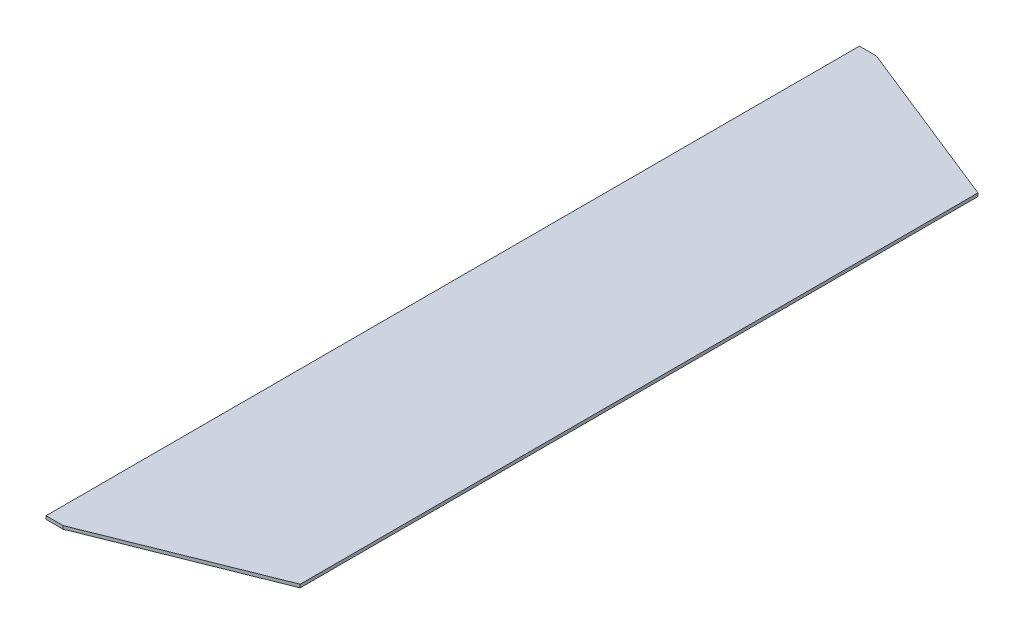
ISO-10303-21;
HEADER;
FILE_DESCRIPTION(('STEP AP214'),'2;1');
FILE_NAME('part.step','',(''),(''),'','','');
FILE_SCHEMA(('AUTOMOTIVE_DESIGN { 1 0 10303 214 1 1 1 1 }'));
ENDSEC;
DATA;
#1=APPLICATION_CONTEXT('core data for automotive mechanical design processes');
#2=APPLICATION_PROTOCOL_DEFINITION('international standard','automotive_design',2000,#1);
#3=PRODUCT_CONTEXT('',#1,'mechanical');
#4=PRODUCT('Part','Part','',(#3));
#5=PRODUCT_RELATED_PRODUCT_CATEGORY('part','',(#4));
#6=PRODUCT_DEFINITION_FORMATION('','',#4);
#7=PRODUCT_DEFINITION_CONTEXT('part definition',#1,'design');
#8=PRODUCT_DEFINITION('design','',#6,#7);
#9=PRODUCT_DEFINITION_SHAPE('','',#8);
#10=(LENGTH_UNIT() NAMED_UNIT(*) SI_UNIT(.MILLI.,.METRE.));
#11=(NAMED_UNIT(*) PLANE_ANGLE_UNIT() SI_UNIT($,.RADIAN.));
#12=(NAMED_UNIT(*) SI_UNIT($,.STERADIAN.) SOLID_ANGLE_UNIT());
#13=UNCERTAINTY_MEASURE_WITH_UNIT(LENGTH_MEASURE(1.E-05),#10,'distance_accuracy_value','');
#14=(GEOMETRIC_REPRESENTATION_CONTEXT(3) GLOBAL_UNCERTAINTY_ASSIGNED_CONTEXT((#13)) GLOBAL_UNIT_ASSIGNED_CONTEXT((#10,
#11,#12)) REPRESENTATION_CONTEXT('',''));
#15=CARTESIAN_POINT('',(0.,0.,0.));
#16=DIRECTION('',(0.,0.,1.));
#17=DIRECTION('',(1.,0.,0.));
#18=AXIS2_PLACEMENT_3D('',#15,#16,#17);
#19=CARTESIAN_POINT('',(34.925,-0.5969,152.4));
#20=DIRECTION('',(0.,1.,0.));
#21=DIRECTION('',(0.,0.,1.));
#22=AXIS2_PLACEMENT_3D('',#19,#20,#21);
#23=PLANE('',#22);
#24=DIRECTION('',(-0.928476690885259,0.,0.371390676354104));
#25=VECTOR('',#24,1.);
#26=CARTESIAN_POINT('',(-28.575,-0.5969,152.4));
#27=LINE('',#26,#25);
#28=CARTESIAN_POINT('',(34.925,-0.5969,127.));
#29=VERTEX_POINT('',#28);
#30=CARTESIAN_POINT('',(-28.575,-0.5969,152.4));
#31=VERTEX_POINT('',#30);
#32=EDGE_CURVE('E105',#29,#31,#27,.T.);
#33=ORIENTED_EDGE('',*,*,#32,.T.);
#34=DIRECTION('',(1.,0.,0.));
#35=VECTOR('',#34,1.);
#36=CARTESIAN_POINT('',(34.925,-0.5969,152.4));
#37=LINE('',#36,#35);
#38=CARTESIAN_POINT('',(-34.925,-0.5969,152.4));
#39=VERTEX_POINT('',#38);
#40=EDGE_CURVE('E115',#39,#31,#37,.T.);
#41=ORIENTED_EDGE('',*,*,#40,.F.);
#42=DIRECTION('',(0.,0.,-1.));
#43=VECTOR('',#42,1.);
#44=CARTESIAN_POINT('',(-34.925,-0.5969,152.4));
#45=LINE('',#44,#43);
#46=CARTESIAN_POINT('',(-34.925,-0.5969,-152.4));
#47=VERTEX_POINT('',#46);
#48=EDGE_CURVE('E12',#39,#47,#45,.T.);
#49=ORIENTED_EDGE('',*,*,#48,.T.);
#50=DIRECTION('',(1.,0.,0.));
#51=VECTOR('',#50,1.);
#52=CARTESIAN_POINT('',(34.925,-0.5969,-152.4));
#53=LINE('',#52,#51);
#54=CARTESIAN_POINT('',(-28.575,-0.5969,-152.4));
#55=VERTEX_POINT('',#54);
#56=EDGE_CURVE('E112',#47,#55,#53,.T.);
#57=ORIENTED_EDGE('',*,*,#56,.T.);
#58=DIRECTION('',(0.928476690885259,0.,0.371390676354103));
#59=VECTOR('',#58,1.);
#60=CARTESIAN_POINT('',(34.925,-0.5969,-127.));
#61=LINE('',#60,#59);
#62=CARTESIAN_POINT('',(34.925,-0.5969,-127.));
#63=VERTEX_POINT('',#62);
#64=EDGE_CURVE('E60',#55,#63,#61,.T.);
#65=ORIENTED_EDGE('',*,*,#64,.T.);
#66=DIRECTION('',(0.,0.,-1.));
#67=VECTOR('',#66,1.);
#68=CARTESIAN_POINT('',(34.925,-0.5969,152.4));
#69=LINE('',#68,#67);
#70=EDGE_CURVE('E45',#29,#63,#69,.T.);
#71=ORIENTED_EDGE('',*,*,#70,.F.);
#72=EDGE_LOOP('',(#33,#41,#49,#57,#65,#71));
#73=FACE_BOUND('',#72,.T.);
#74=ADVANCED_FACE('F37',(#73),#23,.F.);
#75=CARTESIAN_POINT('',(34.925,0.5969,152.4));
#76=DIRECTION('',(-1.,0.,0.));
#77=DIRECTION('',(0.,0.,1.));
#78=AXIS2_PLACEMENT_3D('',#75,#76,#77);
#79=PLANE('',#78);
#80=DIRECTION('',(0.,-1.,0.));
#81=VECTOR('',#80,1.);
#82=CARTESIAN_POINT('',(34.925,0.5969,127.));
#83=LINE('',#82,#81);
#84=CARTESIAN_POINT('',(34.925,0.5969,127.));
#85=VERTEX_POINT('',#84);
#86=EDGE_CURVE('E131',#85,#29,#83,.T.);
#87=ORIENTED_EDGE('',*,*,#86,.T.);
#88=ORIENTED_EDGE('',*,*,#70,.T.);
#89=DIRECTION('',(0.,-1.,0.));
#90=VECTOR('',#89,1.);
#91=CARTESIAN_POINT('',(34.925,0.5969,-127.));
#92=LINE('',#91,#90);
#93=CARTESIAN_POINT('',(34.925,0.5969,-127.));
#94=VERTEX_POINT('',#93);
#95=EDGE_CURVE('E95',#94,#63,#92,.T.);
#96=ORIENTED_EDGE('',*,*,#95,.F.);
#97=DIRECTION('',(0.,0.,-1.));
#98=VECTOR('',#97,1.);
#99=CARTESIAN_POINT('',(34.925,0.5969,152.4));
#100=LINE('',#99,#98);
#101=EDGE_CURVE('E104',#85,#94,#100,.T.);
#102=ORIENTED_EDGE('',*,*,#101,.F.);
#103=EDGE_LOOP('',(#87,#88,#96,#102));
#104=FACE_BOUND('',#103,.T.);
#105=ADVANCED_FACE('F130',(#104),#79,.F.);
#106=CARTESIAN_POINT('',(34.925,0.5969,152.4));
#107=DIRECTION('',(0.,-1.,0.));
#108=DIRECTION('',(0.,0.,-1.));
#109=AXIS2_PLACEMENT_3D('',#106,#107,#108);
#110=PLANE('',#109);
#111=DIRECTION('',(-0.928476690885259,0.,0.371390676354104));
#112=VECTOR('',#111,1.);
#113=CARTESIAN_POINT('',(-28.575,0.5969,152.4));
#114=LINE('',#113,#112);
#115=CARTESIAN_POINT('',(-28.575,0.5969,152.4));
#116=VERTEX_POINT('',#115);
#117=EDGE_CURVE('E52',#85,#116,#114,.T.);
#118=ORIENTED_EDGE('',*,*,#117,.F.);
#119=ORIENTED_EDGE('',*,*,#101,.T.);
#120=DIRECTION('',(0.928476690885259,0.,0.371390676354103));
#121=VECTOR('',#120,1.);
#122=CARTESIAN_POINT('',(34.925,0.5969,-127.));
#123=LINE('',#122,#121);
#124=CARTESIAN_POINT('',(-28.575,0.5969,-152.4));
#125=VERTEX_POINT('',#124);
#126=EDGE_CURVE('E89',#125,#94,#123,.T.);
#127=ORIENTED_EDGE('',*,*,#126,.F.);
#128=DIRECTION('',(-1.,0.,0.));
#129=VECTOR('',#128,1.);
#130=CARTESIAN_POINT('',(34.925,0.5969,-152.4));
#131=LINE('',#130,#129);
#132=CARTESIAN_POINT('',(-34.925,0.5969,-152.4));
#133=VERTEX_POINT('',#132);
#134=EDGE_CURVE('E101',#125,#133,#131,.T.);
#135=ORIENTED_EDGE('',*,*,#134,.T.);
#136=DIRECTION('',(0.,0.,-1.));
#137=VECTOR('',#136,1.);
#138=CARTESIAN_POINT('',(-34.925,0.5969,152.4));
#139=LINE('',#138,#137);
#140=CARTESIAN_POINT('',(-34.925,0.5969,152.4));
#141=VERTEX_POINT('',#140);
#142=EDGE_CURVE('E124',#141,#133,#139,.T.);
#143=ORIENTED_EDGE('',*,*,#142,.F.);
#144=DIRECTION('',(-1.,0.,0.));
#145=VECTOR('',#144,1.);
#146=CARTESIAN_POINT('',(34.925,0.5969,152.4));
#147=LINE('',#146,#145);
#148=EDGE_CURVE('E122',#116,#141,#147,.T.);
#149=ORIENTED_EDGE('',*,*,#148,.F.);
#150=EDGE_LOOP('',(#118,#119,#127,#135,#143,#149));
#151=FACE_BOUND('',#150,.T.);
#152=ADVANCED_FACE('F99',(#151),#110,.F.);
#153=CARTESIAN_POINT('',(0.,0.,152.4));
#154=DIRECTION('',(0.,0.,-1.));
#155=DIRECTION('',(-1.,0.,0.));
#156=AXIS2_PLACEMENT_3D('',#153,#154,#155);
#157=PLANE('',#156);
#158=DIRECTION('',(0.,-1.,0.));
#159=VECTOR('',#158,1.);
#160=CARTESIAN_POINT('',(-28.575,0.5969,152.4));
#161=LINE('',#160,#159);
#162=EDGE_CURVE('E138',#116,#31,#161,.T.);
#163=ORIENTED_EDGE('',*,*,#162,.F.);
#164=ORIENTED_EDGE('',*,*,#148,.T.);
#165=DIRECTION('',(0.,-1.,0.));
#166=VECTOR('',#165,1.);
#167=CARTESIAN_POINT('',(-34.925,0.5969,152.4));
#168=LINE('',#167,#166);
#169=EDGE_CURVE('E111',#141,#39,#168,.T.);
#170=ORIENTED_EDGE('',*,*,#169,.T.);
#171=ORIENTED_EDGE('',*,*,#40,.T.);
#172=EDGE_LOOP('',(#163,#164,#170,#171));
#173=FACE_BOUND('',#172,.T.);
#174=ADVANCED_FACE('F146',(#173),#157,.F.);
#175=CARTESIAN_POINT('',(0.,0.,-152.4));
#176=DIRECTION('',(0.,0.,-1.));
#177=DIRECTION('',(-1.,0.,0.));
#178=AXIS2_PLACEMENT_3D('',#175,#176,#177);
#179=PLANE('',#178);
#180=ORIENTED_EDGE('',*,*,#134,.F.);
#181=DIRECTION('',(0.,-1.,0.));
#182=VECTOR('',#181,1.);
#183=CARTESIAN_POINT('',(-28.575,0.5969,-152.4));
#184=LINE('',#183,#182);
#185=EDGE_CURVE('E86',#125,#55,#184,.T.);
#186=ORIENTED_EDGE('',*,*,#185,.T.);
#187=ORIENTED_EDGE('',*,*,#56,.F.);
#188=DIRECTION('',(0.,-1.,0.));
#189=VECTOR('',#188,1.);
#190=CARTESIAN_POINT('',(-34.925,0.5969,-152.4));
#191=LINE('',#190,#189);
#192=EDGE_CURVE('E110',#133,#47,#191,.T.);
#193=ORIENTED_EDGE('',*,*,#192,.F.);
#194=EDGE_LOOP('',(#180,#186,#187,#193));
#195=FACE_BOUND('',#194,.T.);
#196=ADVANCED_FACE('F108',(#195),#179,.T.);
#197=CARTESIAN_POINT('',(-34.925,0.5969,152.4));
#198=DIRECTION('',(1.,0.,0.));
#199=DIRECTION('',(0.,0.,-1.));
#200=AXIS2_PLACEMENT_3D('',#197,#198,#199);
#201=PLANE('',#200);
#202=ORIENTED_EDGE('',*,*,#142,.T.);
#203=ORIENTED_EDGE('',*,*,#192,.T.);
#204=ORIENTED_EDGE('',*,*,#48,.F.);
#205=ORIENTED_EDGE('',*,*,#169,.F.);
#206=EDGE_LOOP('',(#202,#203,#204,#205));
#207=FACE_BOUND('',#206,.T.);
#208=ADVANCED_FACE('F39',(#207),#201,.F.);
#209=CARTESIAN_POINT('',(34.925,0.5969,-127.));
#210=DIRECTION('',(0.371390676354103,0.,-0.928476690885259));
#211=DIRECTION('',(-0.92847669088526,0.,-0.371390676354103));
#212=AXIS2_PLACEMENT_3D('',#209,#210,#211);
#213=PLANE('',#212);
#214=ORIENTED_EDGE('',*,*,#64,.F.);
#215=ORIENTED_EDGE('',*,*,#185,.F.);
#216=ORIENTED_EDGE('',*,*,#126,.T.);
#217=ORIENTED_EDGE('',*,*,#95,.T.);
#218=EDGE_LOOP('',(#214,#215,#216,#217));
#219=FACE_BOUND('',#218,.T.);
#220=ADVANCED_FACE('F88',(#219),#213,.T.);
#221=CARTESIAN_POINT('',(-28.575,0.5969,152.4));
#222=DIRECTION('',(0.371390676354104,0.,0.928476690885259));
#223=DIRECTION('',(0.928476690885259,0.,-0.371390676354104));
#224=AXIS2_PLACEMENT_3D('',#221,#222,#223);
#225=PLANE('',#224);
#226=ORIENTED_EDGE('',*,*,#32,.F.);
#227=ORIENTED_EDGE('',*,*,#86,.F.);
#228=ORIENTED_EDGE('',*,*,#117,.T.);
#229=ORIENTED_EDGE('',*,*,#162,.T.);
#230=EDGE_LOOP('',(#226,#227,#228,#229));
#231=FACE_BOUND('',#230,.T.);
#232=ADVANCED_FACE('F147',(#231),#225,.T.);
#233=CLOSED_SHELL('',(#74,#105,#152,#174,#196,#208,#220,#232));
#234=MANIFOLD_SOLID_BREP('B2',#233);
#235=ADVANCED_BREP_SHAPE_REPRESENTATION('',(#18,#234),#14);
#236=SHAPE_DEFINITION_REPRESENTATION(#9,#235);
ENDSEC;
END-ISO-10303-21;
